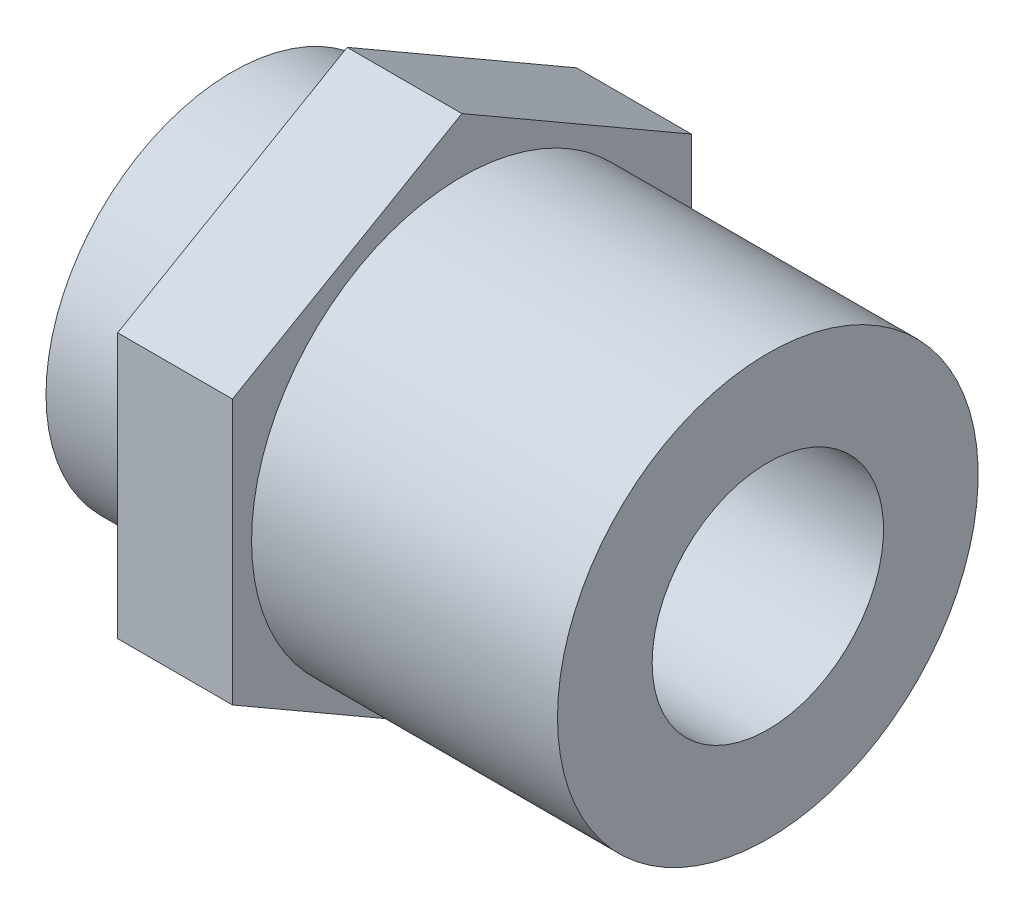
ISO-10303-21;
HEADER;
FILE_DESCRIPTION(('STEP AP214'),'2;1');
FILE_NAME('part.step','',(''),(''),'','','');
FILE_SCHEMA(('AUTOMOTIVE_DESIGN { 1 0 10303 214 1 1 1 1 }'));
ENDSEC;
DATA;
#1=APPLICATION_CONTEXT('core data for automotive mechanical design processes');
#2=APPLICATION_PROTOCOL_DEFINITION('international standard','automotive_design',2000,#1);
#3=PRODUCT_CONTEXT('',#1,'mechanical');
#4=PRODUCT('Part','Part','',(#3));
#5=PRODUCT_RELATED_PRODUCT_CATEGORY('part','',(#4));
#6=PRODUCT_DEFINITION_FORMATION('','',#4);
#7=PRODUCT_DEFINITION_CONTEXT('part definition',#1,'design');
#8=PRODUCT_DEFINITION('design','',#6,#7);
#9=PRODUCT_DEFINITION_SHAPE('','',#8);
#10=(LENGTH_UNIT() NAMED_UNIT(*) SI_UNIT(.MILLI.,.METRE.));
#11=(NAMED_UNIT(*) PLANE_ANGLE_UNIT() SI_UNIT($,.RADIAN.));
#12=(NAMED_UNIT(*) SI_UNIT($,.STERADIAN.) SOLID_ANGLE_UNIT());
#13=UNCERTAINTY_MEASURE_WITH_UNIT(LENGTH_MEASURE(1.E-05),#10,'distance_accuracy_value','');
#14=(GEOMETRIC_REPRESENTATION_CONTEXT(3) GLOBAL_UNCERTAINTY_ASSIGNED_CONTEXT((#13)) GLOBAL_UNIT_ASSIGNED_CONTEXT((#10,
#11,#12)) REPRESENTATION_CONTEXT('',''));
#15=CARTESIAN_POINT('',(0.,0.,0.));
#16=DIRECTION('',(0.,0.,1.));
#17=DIRECTION('',(1.,0.,0.));
#18=AXIS2_PLACEMENT_3D('',#15,#16,#17);
#19=CARTESIAN_POINT('',(-8.,0.,0.));
#20=DIRECTION('',(1.,0.,0.));
#21=DIRECTION('',(0.,0.,1.));
#22=AXIS2_PLACEMENT_3D('',#19,#20,#21);
#23=CYLINDRICAL_SURFACE('',#22,6.05);
#24=DIRECTION('',(1.,0.,0.));
#25=VECTOR('',#24,1.);
#26=CARTESIAN_POINT('',(-8.,0.,6.05));
#27=LINE('',#26,#25);
#28=CARTESIAN_POINT('',(-6.,0.,6.05));
#29=VERTEX_POINT('',#28);
#30=CARTESIAN_POINT('',(22.,0.,6.05));
#31=VERTEX_POINT('',#30);
#32=EDGE_CURVE('E9',#29,#31,#27,.T.);
#33=ORIENTED_EDGE('',*,*,#32,.F.);
#34=CARTESIAN_POINT('',(-6.,0.,0.));
#35=DIRECTION('',(1.,0.,0.));
#36=DIRECTION('',(0.,0.,1.));
#37=AXIS2_PLACEMENT_3D('',#34,#35,#36);
#38=CIRCLE('',#37,6.05);
#39=EDGE_CURVE('E202',#29,#29,#38,.T.);
#40=ORIENTED_EDGE('',*,*,#39,.F.);
#41=ORIENTED_EDGE('',*,*,#32,.T.);
#42=CARTESIAN_POINT('',(22.,0.,0.));
#43=DIRECTION('',(1.,0.,0.));
#44=DIRECTION('',(0.,0.,1.));
#45=AXIS2_PLACEMENT_3D('',#42,#43,#44);
#46=CIRCLE('',#45,6.05);
#47=EDGE_CURVE('E24',#31,#31,#46,.T.);
#48=ORIENTED_EDGE('',*,*,#47,.T.);
#49=EDGE_LOOP('',(#33,#40,#41,#48));
#50=FACE_BOUND('',#49,.T.);
#51=ADVANCED_FACE('F15',(#50),#23,.F.);
#52=CARTESIAN_POINT('',(22.,0.,0.));
#53=DIRECTION('',(1.,0.,0.));
#54=DIRECTION('',(0.,1.,0.));
#55=AXIS2_PLACEMENT_3D('',#52,#53,#54);
#56=PLANE('',#55);
#57=ORIENTED_EDGE('',*,*,#47,.F.);
#58=EDGE_LOOP('',(#57));
#59=FACE_BOUND('',#58,.T.);
#60=CARTESIAN_POINT('',(22.,0.,0.));
#61=DIRECTION('',(1.,0.,0.));
#62=DIRECTION('',(0.,0.,1.));
#63=AXIS2_PLACEMENT_3D('',#60,#61,#62);
#64=CIRCLE('',#63,11.);
#65=CARTESIAN_POINT('',(22.,0.,11.));
#66=VERTEX_POINT('',#65);
#67=EDGE_CURVE('E160',#66,#66,#64,.T.);
#68=ORIENTED_EDGE('',*,*,#67,.T.);
#69=EDGE_LOOP('',(#68));
#70=FACE_BOUND('',#69,.T.);
#71=ADVANCED_FACE('F17',(#59,#70),#56,.T.);
#72=CARTESIAN_POINT('',(-6.,0.,0.));
#73=DIRECTION('',(1.,0.,0.));
#74=DIRECTION('',(0.,1.,0.));
#75=AXIS2_PLACEMENT_3D('',#72,#73,#74);
#76=PLANE('',#75);
#77=ORIENTED_EDGE('',*,*,#39,.T.);
#78=EDGE_LOOP('',(#77));
#79=FACE_BOUND('',#78,.T.);
#80=CARTESIAN_POINT('',(-6.,0.,0.));
#81=DIRECTION('',(1.,0.,0.));
#82=DIRECTION('',(0.,0.,1.));
#83=AXIS2_PLACEMENT_3D('',#80,#81,#82);
#84=CIRCLE('',#83,9.75);
#85=CARTESIAN_POINT('',(-6.,0.,9.75));
#86=VERTEX_POINT('',#85);
#87=EDGE_CURVE('E152',#86,#86,#84,.T.);
#88=ORIENTED_EDGE('',*,*,#87,.F.);
#89=EDGE_LOOP('',(#88));
#90=FACE_BOUND('',#89,.T.);
#91=ADVANCED_FACE('F213',(#79,#90),#76,.F.);
#92=CARTESIAN_POINT('',(6.,0.,0.));
#93=DIRECTION('',(1.,0.,0.));
#94=DIRECTION('',(0.,0.,1.));
#95=AXIS2_PLACEMENT_3D('',#92,#93,#94);
#96=CYLINDRICAL_SURFACE('',#95,11.);
#97=ORIENTED_EDGE('',*,*,#67,.F.);
#98=DIRECTION('',(1.,0.,0.));
#99=VECTOR('',#98,1.);
#100=CARTESIAN_POINT('',(6.,0.,11.));
#101=LINE('',#100,#99);
#102=CARTESIAN_POINT('',(6.,0.,11.));
#103=VERTEX_POINT('',#102);
#104=EDGE_CURVE('E205',#103,#66,#101,.T.);
#105=ORIENTED_EDGE('',*,*,#104,.F.);
#106=CARTESIAN_POINT('',(6.,0.,0.));
#107=DIRECTION('',(1.,0.,0.));
#108=DIRECTION('',(0.,0.,1.));
#109=AXIS2_PLACEMENT_3D('',#106,#107,#108);
#110=CIRCLE('',#109,11.);
#111=EDGE_CURVE('E190',#103,#103,#110,.T.);
#112=ORIENTED_EDGE('',*,*,#111,.T.);
#113=ORIENTED_EDGE('',*,*,#104,.T.);
#114=EDGE_LOOP('',(#97,#105,#112,#113));
#115=FACE_BOUND('',#114,.T.);
#116=ADVANCED_FACE('F216',(#115),#96,.T.);
#117=CARTESIAN_POINT('',(-6.,0.,0.));
#118=DIRECTION('',(1.,0.,0.));
#119=DIRECTION('',(0.,0.,1.));
#120=AXIS2_PLACEMENT_3D('',#117,#118,#119);
#121=CYLINDRICAL_SURFACE('',#120,9.75);
#122=CARTESIAN_POINT('',(0.,0.,0.));
#123=DIRECTION('',(1.,0.,0.));
#124=DIRECTION('',(0.,0.,1.));
#125=AXIS2_PLACEMENT_3D('',#122,#123,#124);
#126=CIRCLE('',#125,9.75);
#127=CARTESIAN_POINT('',(0.,0.,9.75));
#128=VERTEX_POINT('',#127);
#129=EDGE_CURVE('E178',#128,#128,#126,.T.);
#130=ORIENTED_EDGE('',*,*,#129,.F.);
#131=DIRECTION('',(1.,0.,0.));
#132=VECTOR('',#131,1.);
#133=CARTESIAN_POINT('',(-6.,0.,9.75));
#134=LINE('',#133,#132);
#135=EDGE_CURVE('E158',#86,#128,#134,.T.);
#136=ORIENTED_EDGE('',*,*,#135,.F.);
#137=ORIENTED_EDGE('',*,*,#87,.T.);
#138=ORIENTED_EDGE('',*,*,#135,.T.);
#139=EDGE_LOOP('',(#130,#136,#137,#138));
#140=FACE_BOUND('',#139,.T.);
#141=ADVANCED_FACE('F257',(#140),#121,.T.);
#142=CARTESIAN_POINT('',(0.,-13.85640646055,0.));
#143=DIRECTION('',(0.,0.866025403784329,0.50000000000019));
#144=DIRECTION('',(1.,0.,0.));
#145=AXIS2_PLACEMENT_3D('',#142,#143,#144);
#146=PLANE('',#145);
#147=DIRECTION('',(0.,0.50000000000019,-0.866025403784329));
#148=VECTOR('',#147,1.);
#149=CARTESIAN_POINT('',(0.,-13.85640646055,0.));
#150=LINE('',#149,#148);
#151=CARTESIAN_POINT('',(0.,-13.85640646055,0.));
#152=VERTEX_POINT('',#151);
#153=CARTESIAN_POINT('',(0.,-6.928203230276,-12.));
#154=VERTEX_POINT('',#153);
#155=EDGE_CURVE('E168',#152,#154,#150,.T.);
#156=ORIENTED_EDGE('',*,*,#155,.T.);
#157=DIRECTION('',(1.,0.,0.));
#158=VECTOR('',#157,1.);
#159=CARTESIAN_POINT('',(0.,-6.928203230276,-12.));
#160=LINE('',#159,#158);
#161=CARTESIAN_POINT('',(6.,-6.928203230276,-12.));
#162=VERTEX_POINT('',#161);
#163=EDGE_CURVE('E191',#154,#162,#160,.T.);
#164=ORIENTED_EDGE('',*,*,#163,.T.);
#165=DIRECTION('',(0.,0.50000000000019,-0.866025403784329));
#166=VECTOR('',#165,1.);
#167=CARTESIAN_POINT('',(6.,-13.85640646055,0.));
#168=LINE('',#167,#166);
#169=CARTESIAN_POINT('',(6.,-13.85640646055,0.));
#170=VERTEX_POINT('',#169);
#171=EDGE_CURVE('E157',#170,#162,#168,.T.);
#172=ORIENTED_EDGE('',*,*,#171,.F.);
#173=DIRECTION('',(1.,0.,0.));
#174=VECTOR('',#173,1.);
#175=CARTESIAN_POINT('',(0.,-13.85640646055,0.));
#176=LINE('',#175,#174);
#177=EDGE_CURVE('E192',#152,#170,#176,.T.);
#178=ORIENTED_EDGE('',*,*,#177,.F.);
#179=EDGE_LOOP('',(#156,#164,#172,#178));
#180=FACE_BOUND('',#179,.T.);
#181=ADVANCED_FACE('F233',(#180),#146,.F.);
#182=CARTESIAN_POINT('',(0.,-6.928203230276,12.));
#183=DIRECTION('',(0.,0.866025403784329,-0.50000000000019));
#184=DIRECTION('',(-1.,0.,0.));
#185=AXIS2_PLACEMENT_3D('',#182,#183,#184);
#186=PLANE('',#185);
#187=DIRECTION('',(0.,-0.50000000000019,-0.866025403784329));
#188=VECTOR('',#187,1.);
#189=CARTESIAN_POINT('',(0.,-6.928203230276,12.));
#190=LINE('',#189,#188);
#191=CARTESIAN_POINT('',(0.,-6.928203230276,12.));
#192=VERTEX_POINT('',#191);
#193=EDGE_CURVE('E173',#192,#152,#190,.T.);
#194=ORIENTED_EDGE('',*,*,#193,.T.);
#195=ORIENTED_EDGE('',*,*,#177,.T.);
#196=DIRECTION('',(0.,-0.50000000000019,-0.866025403784329));
#197=VECTOR('',#196,1.);
#198=CARTESIAN_POINT('',(6.,-6.928203230276,12.));
#199=LINE('',#198,#197);
#200=CARTESIAN_POINT('',(6.,-6.928203230276,12.));
#201=VERTEX_POINT('',#200);
#202=EDGE_CURVE('E162',#201,#170,#199,.T.);
#203=ORIENTED_EDGE('',*,*,#202,.F.);
#204=DIRECTION('',(1.,0.,0.));
#205=VECTOR('',#204,1.);
#206=CARTESIAN_POINT('',(0.,-6.928203230276,12.));
#207=LINE('',#206,#205);
#208=EDGE_CURVE('E151',#192,#201,#207,.T.);
#209=ORIENTED_EDGE('',*,*,#208,.F.);
#210=EDGE_LOOP('',(#194,#195,#203,#209));
#211=FACE_BOUND('',#210,.T.);
#212=ADVANCED_FACE('F229',(#211),#186,.F.);
#213=CARTESIAN_POINT('',(0.,-6.928203230276,-12.));
#214=DIRECTION('',(0.,0.,1.));
#215=DIRECTION('',(0.,-1.,0.));
#216=AXIS2_PLACEMENT_3D('',#213,#214,#215);
#217=PLANE('',#216);
#218=DIRECTION('',(0.,1.,0.));
#219=VECTOR('',#218,1.);
#220=CARTESIAN_POINT('',(0.,-6.928203230276,-12.));
#221=LINE('',#220,#219);
#222=CARTESIAN_POINT('',(0.,6.928203230275,-12.));
#223=VERTEX_POINT('',#222);
#224=EDGE_CURVE('E147',#154,#223,#221,.T.);
#225=ORIENTED_EDGE('',*,*,#224,.T.);
#226=DIRECTION('',(1.,0.,0.));
#227=VECTOR('',#226,1.);
#228=CARTESIAN_POINT('',(0.,6.928203230275,-12.));
#229=LINE('',#228,#227);
#230=CARTESIAN_POINT('',(6.,6.928203230275,-12.));
#231=VERTEX_POINT('',#230);
#232=EDGE_CURVE('E111',#223,#231,#229,.T.);
#233=ORIENTED_EDGE('',*,*,#232,.T.);
#234=DIRECTION('',(0.,1.,0.));
#235=VECTOR('',#234,1.);
#236=CARTESIAN_POINT('',(6.,-6.928203230276,-12.));
#237=LINE('',#236,#235);
#238=EDGE_CURVE('E165',#162,#231,#237,.T.);
#239=ORIENTED_EDGE('',*,*,#238,.F.);
#240=ORIENTED_EDGE('',*,*,#163,.F.);
#241=EDGE_LOOP('',(#225,#233,#239,#240));
#242=FACE_BOUND('',#241,.T.);
#243=ADVANCED_FACE('F225',(#242),#217,.F.);
#244=CARTESIAN_POINT('',(6.,0.,0.));
#245=DIRECTION('',(1.,0.,0.));
#246=DIRECTION('',(0.,1.,0.));
#247=AXIS2_PLACEMENT_3D('',#244,#245,#246);
#248=PLANE('',#247);
#249=ORIENTED_EDGE('',*,*,#111,.F.);
#250=EDGE_LOOP('',(#249));
#251=FACE_BOUND('',#250,.T.);
#252=DIRECTION('',(0.,-0.50000000000019,0.866025403784329));
#253=VECTOR('',#252,1.);
#254=CARTESIAN_POINT('',(6.,13.856406460551,0.));
#255=LINE('',#254,#253);
#256=CARTESIAN_POINT('',(6.,13.856406460551,0.));
#257=VERTEX_POINT('',#256);
#258=CARTESIAN_POINT('',(6.,6.928203230276,12.));
#259=VERTEX_POINT('',#258);
#260=EDGE_CURVE('E126',#257,#259,#255,.T.);
#261=ORIENTED_EDGE('',*,*,#260,.T.);
#262=DIRECTION('',(0.,-1.,0.));
#263=VECTOR('',#262,1.);
#264=CARTESIAN_POINT('',(6.,6.928203230276,12.));
#265=LINE('',#264,#263);
#266=EDGE_CURVE('E148',#259,#201,#265,.T.);
#267=ORIENTED_EDGE('',*,*,#266,.T.);
#268=ORIENTED_EDGE('',*,*,#202,.T.);
#269=ORIENTED_EDGE('',*,*,#171,.T.);
#270=ORIENTED_EDGE('',*,*,#238,.T.);
#271=DIRECTION('',(0.,0.50000000000019,0.866025403784329));
#272=VECTOR('',#271,1.);
#273=CARTESIAN_POINT('',(6.,6.928203230275,-12.));
#274=LINE('',#273,#272);
#275=EDGE_CURVE('E118',#231,#257,#274,.T.);
#276=ORIENTED_EDGE('',*,*,#275,.T.);
#277=EDGE_LOOP('',(#261,#267,#268,#269,#270,#276));
#278=FACE_BOUND('',#277,.T.);
#279=ADVANCED_FACE('F218',(#251,#278),#248,.T.);
#280=CARTESIAN_POINT('',(0.,0.,0.));
#281=DIRECTION('',(1.,0.,0.));
#282=DIRECTION('',(0.,1.,0.));
#283=AXIS2_PLACEMENT_3D('',#280,#281,#282);
#284=PLANE('',#283);
#285=ORIENTED_EDGE('',*,*,#129,.T.);
#286=EDGE_LOOP('',(#285));
#287=FACE_BOUND('',#286,.T.);
#288=DIRECTION('',(0.,0.50000000000019,0.866025403784329));
#289=VECTOR('',#288,1.);
#290=CARTESIAN_POINT('',(0.,6.928203230275,-12.));
#291=LINE('',#290,#289);
#292=CARTESIAN_POINT('',(0.,13.856406460551,0.));
#293=VERTEX_POINT('',#292);
#294=EDGE_CURVE('E110',#223,#293,#291,.T.);
#295=ORIENTED_EDGE('',*,*,#294,.F.);
#296=ORIENTED_EDGE('',*,*,#224,.F.);
#297=ORIENTED_EDGE('',*,*,#155,.F.);
#298=ORIENTED_EDGE('',*,*,#193,.F.);
#299=DIRECTION('',(0.,-1.,0.));
#300=VECTOR('',#299,1.);
#301=CARTESIAN_POINT('',(0.,6.928203230276,12.));
#302=LINE('',#301,#300);
#303=CARTESIAN_POINT('',(0.,6.928203230276,12.));
#304=VERTEX_POINT('',#303);
#305=EDGE_CURVE('E135',#304,#192,#302,.T.);
#306=ORIENTED_EDGE('',*,*,#305,.F.);
#307=DIRECTION('',(0.,-0.50000000000019,0.866025403784329));
#308=VECTOR('',#307,1.);
#309=CARTESIAN_POINT('',(0.,13.856406460551,0.));
#310=LINE('',#309,#308);
#311=EDGE_CURVE('E124',#293,#304,#310,.T.);
#312=ORIENTED_EDGE('',*,*,#311,.F.);
#313=EDGE_LOOP('',(#295,#296,#297,#298,#306,#312));
#314=FACE_BOUND('',#313,.T.);
#315=ADVANCED_FACE('F129',(#287,#314),#284,.F.);
#316=CARTESIAN_POINT('',(0.,6.928203230276,12.));
#317=DIRECTION('',(0.,0.,-1.));
#318=DIRECTION('',(0.,-1.,0.));
#319=AXIS2_PLACEMENT_3D('',#316,#317,#318);
#320=PLANE('',#319);
#321=ORIENTED_EDGE('',*,*,#305,.T.);
#322=ORIENTED_EDGE('',*,*,#208,.T.);
#323=ORIENTED_EDGE('',*,*,#266,.F.);
#324=DIRECTION('',(1.,0.,0.));
#325=VECTOR('',#324,1.);
#326=CARTESIAN_POINT('',(0.,6.928203230276,12.));
#327=LINE('',#326,#325);
#328=EDGE_CURVE('E134',#304,#259,#327,.T.);
#329=ORIENTED_EDGE('',*,*,#328,.F.);
#330=EDGE_LOOP('',(#321,#322,#323,#329));
#331=FACE_BOUND('',#330,.T.);
#332=ADVANCED_FACE('F223',(#331),#320,.F.);
#333=CARTESIAN_POINT('',(0.,6.928203230275,-12.));
#334=DIRECTION('',(0.,-0.866025403784329,0.50000000000019));
#335=DIRECTION('',(-1.,0.,0.));
#336=AXIS2_PLACEMENT_3D('',#333,#334,#335);
#337=PLANE('',#336);
#338=ORIENTED_EDGE('',*,*,#294,.T.);
#339=DIRECTION('',(1.,0.,0.));
#340=VECTOR('',#339,1.);
#341=CARTESIAN_POINT('',(0.,13.856406460551,0.));
#342=LINE('',#341,#340);
#343=EDGE_CURVE('E112',#293,#257,#342,.T.);
#344=ORIENTED_EDGE('',*,*,#343,.T.);
#345=ORIENTED_EDGE('',*,*,#275,.F.);
#346=ORIENTED_EDGE('',*,*,#232,.F.);
#347=EDGE_LOOP('',(#338,#344,#345,#346));
#348=FACE_BOUND('',#347,.T.);
#349=ADVANCED_FACE('F108',(#348),#337,.F.);
#350=CARTESIAN_POINT('',(0.,13.856406460551,0.));
#351=DIRECTION('',(0.,-0.866025403784329,-0.50000000000019));
#352=DIRECTION('',(0.,0.50000000000019,-0.866025403784329));
#353=AXIS2_PLACEMENT_3D('',#350,#351,#352);
#354=PLANE('',#353);
#355=ORIENTED_EDGE('',*,*,#311,.T.);
#356=ORIENTED_EDGE('',*,*,#328,.T.);
#357=ORIENTED_EDGE('',*,*,#260,.F.);
#358=ORIENTED_EDGE('',*,*,#343,.F.);
#359=EDGE_LOOP('',(#355,#356,#357,#358));
#360=FACE_BOUND('',#359,.T.);
#361=ADVANCED_FACE('F123',(#360),#354,.F.);
#362=CLOSED_SHELL('',(#51,#71,#91,#116,#141,#181,#212,#243,#279,#315,#332,#349,#361));
#363=MANIFOLD_SOLID_BREP('B1',#362);
#364=ADVANCED_BREP_SHAPE_REPRESENTATION('',(#18,#363),#14);
#365=SHAPE_DEFINITION_REPRESENTATION(#9,#364);
ENDSEC;
END-ISO-10303-21;
